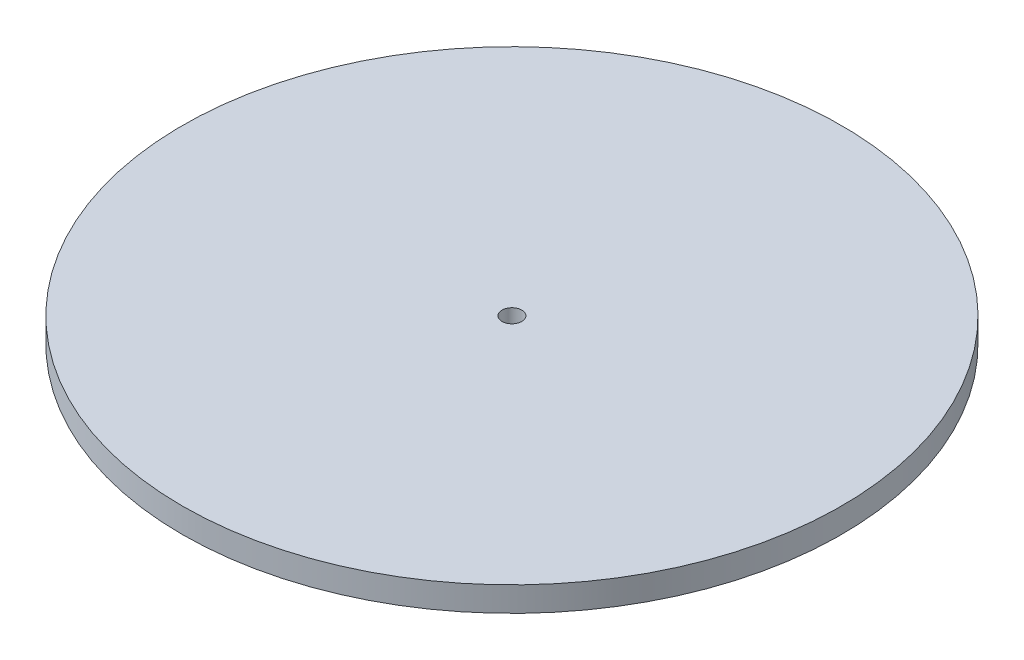
ISO-10303-21;
HEADER;
FILE_DESCRIPTION(('STEP AP214'),'2;1');
FILE_NAME('part.step','',(''),(''),'','','');
FILE_SCHEMA(('AUTOMOTIVE_DESIGN { 1 0 10303 214 1 1 1 1 }'));
ENDSEC;
DATA;
#1=APPLICATION_CONTEXT('core data for automotive mechanical design processes');
#2=APPLICATION_PROTOCOL_DEFINITION('international standard','automotive_design',2000,#1);
#3=PRODUCT_CONTEXT('',#1,'mechanical');
#4=PRODUCT('Part','Part','',(#3));
#5=PRODUCT_RELATED_PRODUCT_CATEGORY('part','',(#4));
#6=PRODUCT_DEFINITION_FORMATION('','',#4);
#7=PRODUCT_DEFINITION_CONTEXT('part definition',#1,'design');
#8=PRODUCT_DEFINITION('design','',#6,#7);
#9=PRODUCT_DEFINITION_SHAPE('','',#8);
#10=(LENGTH_UNIT() NAMED_UNIT(*) SI_UNIT(.MILLI.,.METRE.));
#11=(NAMED_UNIT(*) PLANE_ANGLE_UNIT() SI_UNIT($,.RADIAN.));
#12=(NAMED_UNIT(*) SI_UNIT($,.STERADIAN.) SOLID_ANGLE_UNIT());
#13=UNCERTAINTY_MEASURE_WITH_UNIT(LENGTH_MEASURE(1.E-05),#10,'distance_accuracy_value','');
#14=(GEOMETRIC_REPRESENTATION_CONTEXT(3) GLOBAL_UNCERTAINTY_ASSIGNED_CONTEXT((#13)) GLOBAL_UNIT_ASSIGNED_CONTEXT((#10,
#11,#12)) REPRESENTATION_CONTEXT('',''));
#15=CARTESIAN_POINT('',(0.,0.,0.));
#16=DIRECTION('',(0.,0.,1.));
#17=DIRECTION('',(1.,0.,0.));
#18=AXIS2_PLACEMENT_3D('',#15,#16,#17);
#19=CARTESIAN_POINT('',(0.,20.8887170618497,0.));
#20=DIRECTION('',(0.,1.,0.));
#21=DIRECTION('',(0.,0.,1.));
#22=AXIS2_PLACEMENT_3D('',#19,#20,#21);
#23=CYLINDRICAL_SURFACE('',#22,40.);
#24=CARTESIAN_POINT('',(0.,20.8887170618497,0.));
#25=DIRECTION('',(0.,1.,0.));
#26=DIRECTION('',(0.,0.,1.));
#27=AXIS2_PLACEMENT_3D('',#24,#25,#26);
#28=CIRCLE('',#27,40.);
#29=CARTESIAN_POINT('',(0.,20.8887170618497,40.));
#30=VERTEX_POINT('',#29);
#31=EDGE_CURVE('E50',#30,#30,#28,.T.);
#32=ORIENTED_EDGE('',*,*,#31,.F.);
#33=EDGE_LOOP('',(#32));
#34=FACE_BOUND('',#33,.T.);
#35=CARTESIAN_POINT('',(0.,17.8887170618497,0.));
#36=DIRECTION('',(0.,1.,0.));
#37=DIRECTION('',(0.,0.,1.));
#38=AXIS2_PLACEMENT_3D('',#35,#36,#37);
#39=CIRCLE('',#38,40.);
#40=CARTESIAN_POINT('',(0.,17.8887170618497,40.));
#41=VERTEX_POINT('',#40);
#42=EDGE_CURVE('E10',#41,#41,#39,.T.);
#43=ORIENTED_EDGE('',*,*,#42,.T.);
#44=EDGE_LOOP('',(#43));
#45=FACE_BOUND('',#44,.T.);
#46=ADVANCED_FACE('F31',(#34,#45),#23,.T.);
#47=CARTESIAN_POINT('',(37.,17.8887170618497,0.));
#48=DIRECTION('',(0.,1.,0.));
#49=DIRECTION('',(0.,0.,1.));
#50=AXIS2_PLACEMENT_3D('',#47,#48,#49);
#51=PLANE('',#50);
#52=ORIENTED_EDGE('',*,*,#42,.F.);
#53=EDGE_LOOP('',(#52));
#54=FACE_BOUND('',#53,.T.);
#55=CARTESIAN_POINT('',(0.,17.8887170618497,0.));
#56=DIRECTION('',(0.,1.,0.));
#57=DIRECTION('',(0.,0.,1.));
#58=AXIS2_PLACEMENT_3D('',#55,#56,#57);
#59=CIRCLE('',#58,37.);
#60=CARTESIAN_POINT('',(0.,17.8887170618497,37.));
#61=VERTEX_POINT('',#60);
#62=EDGE_CURVE('E37',#61,#61,#59,.T.);
#63=ORIENTED_EDGE('',*,*,#62,.T.);
#64=EDGE_LOOP('',(#63));
#65=FACE_BOUND('',#64,.T.);
#66=ADVANCED_FACE('F71',(#54,#65),#51,.F.);
#67=CARTESIAN_POINT('',(0.,20.8887170618497,0.));
#68=DIRECTION('',(0.,1.,0.));
#69=DIRECTION('',(0.,0.,1.));
#70=AXIS2_PLACEMENT_3D('',#67,#68,#69);
#71=CYLINDRICAL_SURFACE('',#70,37.0000000000004);
#72=ORIENTED_EDGE('',*,*,#62,.F.);
#73=EDGE_LOOP('',(#72));
#74=FACE_BOUND('',#73,.T.);
#75=CARTESIAN_POINT('',(0.,16.8887170618501,0.));
#76=DIRECTION('',(0.,1.,0.));
#77=DIRECTION('',(0.,0.,1.));
#78=AXIS2_PLACEMENT_3D('',#75,#76,#77);
#79=CIRCLE('',#78,37.0000000000009);
#80=CARTESIAN_POINT('',(0.,16.8887170618501,37.0000000000009));
#81=VERTEX_POINT('',#80);
#82=EDGE_CURVE('E41',#81,#81,#79,.T.);
#83=ORIENTED_EDGE('',*,*,#82,.T.);
#84=EDGE_LOOP('',(#83));
#85=FACE_BOUND('',#84,.T.);
#86=ADVANCED_FACE('F67',(#74,#85),#71,.T.);
#87=CARTESIAN_POINT('',(-1.94576342885111E-12,0.,0.));
#88=CARTESIAN_POINT('',(4.62500002360034,-0.0683858527277108,0.));
#89=CARTESIAN_POINT('',(9.25000001796281,2.5633232725192,0.));
#90=CARTESIAN_POINT('',(13.8750000123401,5.19366334267867,0.));
#91=CARTESIAN_POINT('',(18.5000000115511,7.37764115596199,0.));
#92=CARTESIAN_POINT('',(23.1250000047012,10.1213109615713,0.));
#93=CARTESIAN_POINT('',(27.7500000037658,12.318806226105,0.));
#94=CARTESIAN_POINT('',(32.3750000010504,14.6806746662168,0.));
#95=CARTESIAN_POINT('',(37.0000000000009,16.8887170618501,0.));
#96=B_SPLINE_CURVE_WITH_KNOTS('',8,(#87,#88,#89,#90,#91,#92,#93,#94,#95),.UNSPECIFIED.,.F.,.F.,
(9,9),(0.0831578397080693,0.916661178026126),.UNSPECIFIED.);
#97=CARTESIAN_POINT('',(0.,20.8887170618497,0.));
#98=DIRECTION('',(0.,1.,0.));
#99=AXIS1_PLACEMENT('',#97,#98);
#100=SURFACE_OF_REVOLUTION('',#96,#99);
#101=CARTESIAN_POINT('',(0.,0.05679241070582,0.));
#102=DIRECTION('',(0.,1.,0.));
#103=DIRECTION('',(0.,0.,1.));
#104=AXIS2_PLACEMENT_3D('',#101,#102,#103);
#105=CIRCLE('',#104,1.2);
#106=CARTESIAN_POINT('',(0.,0.05679241070582,1.2));
#107=VERTEX_POINT('',#106);
#108=EDGE_CURVE('E53',#107,#107,#105,.T.);
#109=ORIENTED_EDGE('',*,*,#108,.T.);
#110=EDGE_LOOP('',(#109));
#111=FACE_BOUND('',#110,.T.);
#112=ORIENTED_EDGE('',*,*,#82,.F.);
#113=EDGE_LOOP('',(#112));
#114=FACE_BOUND('',#113,.T.);
#115=ADVANCED_FACE('F62',(#111,#114),#100,.T.);
#116=CARTESIAN_POINT('',(0.,20.8887170618497,0.));
#117=DIRECTION('',(0.,1.,0.));
#118=DIRECTION('',(0.,0.,1.));
#119=AXIS2_PLACEMENT_3D('',#116,#117,#118);
#120=CYLINDRICAL_SURFACE('',#119,1.2);
#121=CARTESIAN_POINT('',(0.,20.8887170618497,0.));
#122=DIRECTION('',(0.,1.,0.));
#123=DIRECTION('',(0.,0.,1.));
#124=AXIS2_PLACEMENT_3D('',#121,#122,#123);
#125=CIRCLE('',#124,1.2);
#126=CARTESIAN_POINT('',(0.,20.8887170618497,1.2));
#127=VERTEX_POINT('',#126);
#128=EDGE_CURVE('E45',#127,#127,#125,.T.);
#129=ORIENTED_EDGE('',*,*,#128,.T.);
#130=EDGE_LOOP('',(#129));
#131=FACE_BOUND('',#130,.T.);
#132=ORIENTED_EDGE('',*,*,#108,.F.);
#133=EDGE_LOOP('',(#132));
#134=FACE_BOUND('',#133,.T.);
#135=ADVANCED_FACE('F66',(#131,#134),#120,.F.);
#136=CARTESIAN_POINT('',(40.,20.8887170618497,0.));
#137=DIRECTION('',(0.,-1.,0.));
#138=DIRECTION('',(0.,0.,-1.));
#139=AXIS2_PLACEMENT_3D('',#136,#137,#138);
#140=PLANE('',#139);
#141=ORIENTED_EDGE('',*,*,#128,.F.);
#142=EDGE_LOOP('',(#141));
#143=FACE_BOUND('',#142,.T.);
#144=ORIENTED_EDGE('',*,*,#31,.T.);
#145=EDGE_LOOP('',(#144));
#146=FACE_BOUND('',#145,.T.);
#147=ADVANCED_FACE('F83',(#143,#146),#140,.F.);
#148=CLOSED_SHELL('',(#46,#66,#86,#115,#135,#147));
#149=MANIFOLD_SOLID_BREP('B2',#148);
#150=ADVANCED_BREP_SHAPE_REPRESENTATION('',(#18,#149),#14);
#151=SHAPE_DEFINITION_REPRESENTATION(#9,#150);
ENDSEC;
END-ISO-10303-21;
